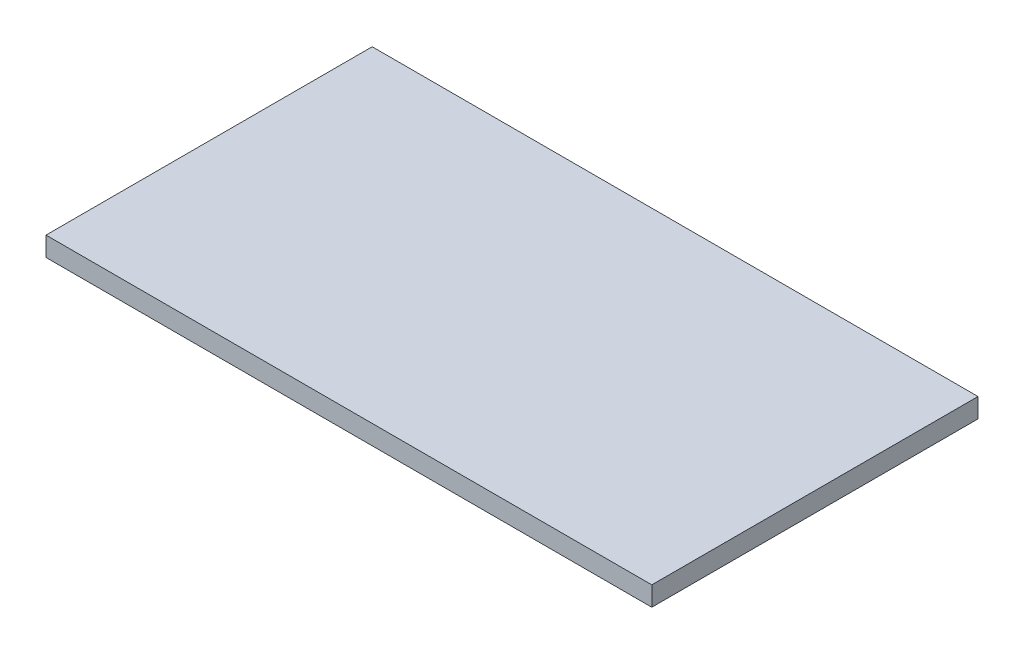
ISO-10303-21;
HEADER;
FILE_DESCRIPTION(('STEP AP214'),'2;1');
FILE_NAME('part.step','',(''),(''),'','','');
FILE_SCHEMA(('AUTOMOTIVE_DESIGN { 1 0 10303 214 1 1 1 1 }'));
ENDSEC;
DATA;
#1=APPLICATION_CONTEXT('core data for automotive mechanical design processes');
#2=APPLICATION_PROTOCOL_DEFINITION('international standard','automotive_design',2000,#1);
#3=PRODUCT_CONTEXT('',#1,'mechanical');
#4=PRODUCT('Part','Part','',(#3));
#5=PRODUCT_RELATED_PRODUCT_CATEGORY('part','',(#4));
#6=PRODUCT_DEFINITION_FORMATION('','',#4);
#7=PRODUCT_DEFINITION_CONTEXT('part definition',#1,'design');
#8=PRODUCT_DEFINITION('design','',#6,#7);
#9=PRODUCT_DEFINITION_SHAPE('','',#8);
#10=(LENGTH_UNIT() NAMED_UNIT(*) SI_UNIT(.MILLI.,.METRE.));
#11=(NAMED_UNIT(*) PLANE_ANGLE_UNIT() SI_UNIT($,.RADIAN.));
#12=(NAMED_UNIT(*) SI_UNIT($,.STERADIAN.) SOLID_ANGLE_UNIT());
#13=UNCERTAINTY_MEASURE_WITH_UNIT(LENGTH_MEASURE(1.E-05),#10,'distance_accuracy_value','');
#14=(GEOMETRIC_REPRESENTATION_CONTEXT(3) GLOBAL_UNCERTAINTY_ASSIGNED_CONTEXT((#13)) GLOBAL_UNIT_ASSIGNED_CONTEXT((#10,
#11,#12)) REPRESENTATION_CONTEXT('',''));
#15=CARTESIAN_POINT('',(0.,0.,0.));
#16=DIRECTION('',(0.,0.,1.));
#17=DIRECTION('',(1.,0.,0.));
#18=AXIS2_PLACEMENT_3D('',#15,#16,#17);
#19=CARTESIAN_POINT('',(0.,-1.27,0.));
#20=DIRECTION('',(-1.,0.,0.));
#21=DIRECTION('',(0.,0.,1.));
#22=AXIS2_PLACEMENT_3D('',#19,#20,#21);
#23=PLANE('',#22);
#24=DIRECTION('',(0.,0.,1.));
#25=VECTOR('',#24,1.);
#26=CARTESIAN_POINT('',(0.,0.,0.));
#27=LINE('',#26,#25);
#28=CARTESIAN_POINT('',(0.,0.,-21.336));
#29=VERTEX_POINT('',#28);
#30=CARTESIAN_POINT('',(0.,0.,0.));
#31=VERTEX_POINT('',#30);
#32=EDGE_CURVE('E97',#29,#31,#27,.T.);
#33=ORIENTED_EDGE('',*,*,#32,.F.);
#34=DIRECTION('',(0.,1.,0.));
#35=VECTOR('',#34,1.);
#36=CARTESIAN_POINT('',(0.,-1.27,-21.336));
#37=LINE('',#36,#35);
#38=CARTESIAN_POINT('',(0.,-1.27,-21.336));
#39=VERTEX_POINT('',#38);
#40=EDGE_CURVE('E11',#39,#29,#37,.T.);
#41=ORIENTED_EDGE('',*,*,#40,.F.);
#42=DIRECTION('',(0.,0.,1.));
#43=VECTOR('',#42,1.);
#44=CARTESIAN_POINT('',(0.,-1.27,0.));
#45=LINE('',#44,#43);
#46=CARTESIAN_POINT('',(0.,-1.27,0.));
#47=VERTEX_POINT('',#46);
#48=EDGE_CURVE('E91',#39,#47,#45,.T.);
#49=ORIENTED_EDGE('',*,*,#48,.T.);
#50=DIRECTION('',(0.,1.,0.));
#51=VECTOR('',#50,1.);
#52=CARTESIAN_POINT('',(0.,-1.27,0.));
#53=LINE('',#52,#51);
#54=EDGE_CURVE('E36',#47,#31,#53,.T.);
#55=ORIENTED_EDGE('',*,*,#54,.T.);
#56=EDGE_LOOP('',(#33,#41,#49,#55));
#57=FACE_BOUND('',#56,.T.);
#58=ADVANCED_FACE('F33',(#57),#23,.T.);
#59=CARTESIAN_POINT('',(0.,-1.27,-21.336));
#60=DIRECTION('',(0.,0.,-1.));
#61=DIRECTION('',(-1.,0.,0.));
#62=AXIS2_PLACEMENT_3D('',#59,#60,#61);
#63=PLANE('',#62);
#64=DIRECTION('',(-1.,0.,0.));
#65=VECTOR('',#64,1.);
#66=CARTESIAN_POINT('',(0.,0.,-21.336));
#67=LINE('',#66,#65);
#68=CARTESIAN_POINT('',(39.624,0.,-21.336));
#69=VERTEX_POINT('',#68);
#70=EDGE_CURVE('E93',#69,#29,#67,.T.);
#71=ORIENTED_EDGE('',*,*,#70,.F.);
#72=DIRECTION('',(0.,1.,0.));
#73=VECTOR('',#72,1.);
#74=CARTESIAN_POINT('',(39.624,-1.27,-21.336));
#75=LINE('',#74,#73);
#76=CARTESIAN_POINT('',(39.624,-1.27,-21.336));
#77=VERTEX_POINT('',#76);
#78=EDGE_CURVE('E42',#77,#69,#75,.T.);
#79=ORIENTED_EDGE('',*,*,#78,.F.);
#80=DIRECTION('',(-1.,0.,0.));
#81=VECTOR('',#80,1.);
#82=CARTESIAN_POINT('',(0.,-1.27,-21.336));
#83=LINE('',#82,#81);
#84=EDGE_CURVE('E88',#77,#39,#83,.T.);
#85=ORIENTED_EDGE('',*,*,#84,.T.);
#86=ORIENTED_EDGE('',*,*,#40,.T.);
#87=EDGE_LOOP('',(#71,#79,#85,#86));
#88=FACE_BOUND('',#87,.T.);
#89=ADVANCED_FACE('F107',(#88),#63,.T.);
#90=CARTESIAN_POINT('',(39.624,-1.27,0.));
#91=DIRECTION('',(1.,0.,0.));
#92=DIRECTION('',(0.,0.,-1.));
#93=AXIS2_PLACEMENT_3D('',#90,#91,#92);
#94=PLANE('',#93);
#95=DIRECTION('',(0.,0.,-1.));
#96=VECTOR('',#95,1.);
#97=CARTESIAN_POINT('',(39.624,0.,0.));
#98=LINE('',#97,#96);
#99=CARTESIAN_POINT('',(39.624,0.,0.));
#100=VERTEX_POINT('',#99);
#101=EDGE_CURVE('E83',#100,#69,#98,.T.);
#102=ORIENTED_EDGE('',*,*,#101,.F.);
#103=DIRECTION('',(0.,1.,0.));
#104=VECTOR('',#103,1.);
#105=CARTESIAN_POINT('',(39.624,-1.27,0.));
#106=LINE('',#105,#104);
#107=CARTESIAN_POINT('',(39.624,-1.27,0.));
#108=VERTEX_POINT('',#107);
#109=EDGE_CURVE('E78',#108,#100,#106,.T.);
#110=ORIENTED_EDGE('',*,*,#109,.F.);
#111=DIRECTION('',(0.,0.,-1.));
#112=VECTOR('',#111,1.);
#113=CARTESIAN_POINT('',(39.624,-1.27,0.));
#114=LINE('',#113,#112);
#115=EDGE_CURVE('E81',#108,#77,#114,.T.);
#116=ORIENTED_EDGE('',*,*,#115,.T.);
#117=ORIENTED_EDGE('',*,*,#78,.T.);
#118=EDGE_LOOP('',(#102,#110,#116,#117));
#119=FACE_BOUND('',#118,.T.);
#120=ADVANCED_FACE('F80',(#119),#94,.T.);
#121=CARTESIAN_POINT('',(0.,-1.27,0.));
#122=DIRECTION('',(0.,0.,1.));
#123=DIRECTION('',(1.,0.,0.));
#124=AXIS2_PLACEMENT_3D('',#121,#122,#123);
#125=PLANE('',#124);
#126=DIRECTION('',(1.,0.,0.));
#127=VECTOR('',#126,1.);
#128=CARTESIAN_POINT('',(0.,0.,0.));
#129=LINE('',#128,#127);
#130=EDGE_CURVE('E100',#31,#100,#129,.T.);
#131=ORIENTED_EDGE('',*,*,#130,.F.);
#132=ORIENTED_EDGE('',*,*,#54,.F.);
#133=DIRECTION('',(1.,0.,0.));
#134=VECTOR('',#133,1.);
#135=CARTESIAN_POINT('',(0.,-1.27,0.));
#136=LINE('',#135,#134);
#137=EDGE_CURVE('E87',#47,#108,#136,.T.);
#138=ORIENTED_EDGE('',*,*,#137,.T.);
#139=ORIENTED_EDGE('',*,*,#109,.T.);
#140=EDGE_LOOP('',(#131,#132,#138,#139));
#141=FACE_BOUND('',#140,.T.);
#142=ADVANCED_FACE('F90',(#141),#125,.T.);
#143=CARTESIAN_POINT('',(0.,-1.27,0.));
#144=DIRECTION('',(0.,-1.,0.));
#145=DIRECTION('',(0.,0.,-1.));
#146=AXIS2_PLACEMENT_3D('',#143,#144,#145);
#147=PLANE('',#146);
#148=ORIENTED_EDGE('',*,*,#48,.F.);
#149=ORIENTED_EDGE('',*,*,#84,.F.);
#150=ORIENTED_EDGE('',*,*,#115,.F.);
#151=ORIENTED_EDGE('',*,*,#137,.F.);
#152=EDGE_LOOP('',(#148,#149,#150,#151));
#153=FACE_BOUND('',#152,.T.);
#154=ADVANCED_FACE('F86',(#153),#147,.T.);
#155=CARTESIAN_POINT('',(0.,0.,0.));
#156=DIRECTION('',(0.,-1.,0.));
#157=DIRECTION('',(0.,0.,-1.));
#158=AXIS2_PLACEMENT_3D('',#155,#156,#157);
#159=PLANE('',#158);
#160=ORIENTED_EDGE('',*,*,#32,.T.);
#161=ORIENTED_EDGE('',*,*,#130,.T.);
#162=ORIENTED_EDGE('',*,*,#101,.T.);
#163=ORIENTED_EDGE('',*,*,#70,.T.);
#164=EDGE_LOOP('',(#160,#161,#162,#163));
#165=FACE_BOUND('',#164,.T.);
#166=ADVANCED_FACE('F106',(#165),#159,.F.);
#167=CLOSED_SHELL('',(#58,#89,#120,#142,#154,#166));
#168=MANIFOLD_SOLID_BREP('B2',#167);
#169=ADVANCED_BREP_SHAPE_REPRESENTATION('',(#18,#168),#14);
#170=SHAPE_DEFINITION_REPRESENTATION(#9,#169);
ENDSEC;
END-ISO-10303-21;
